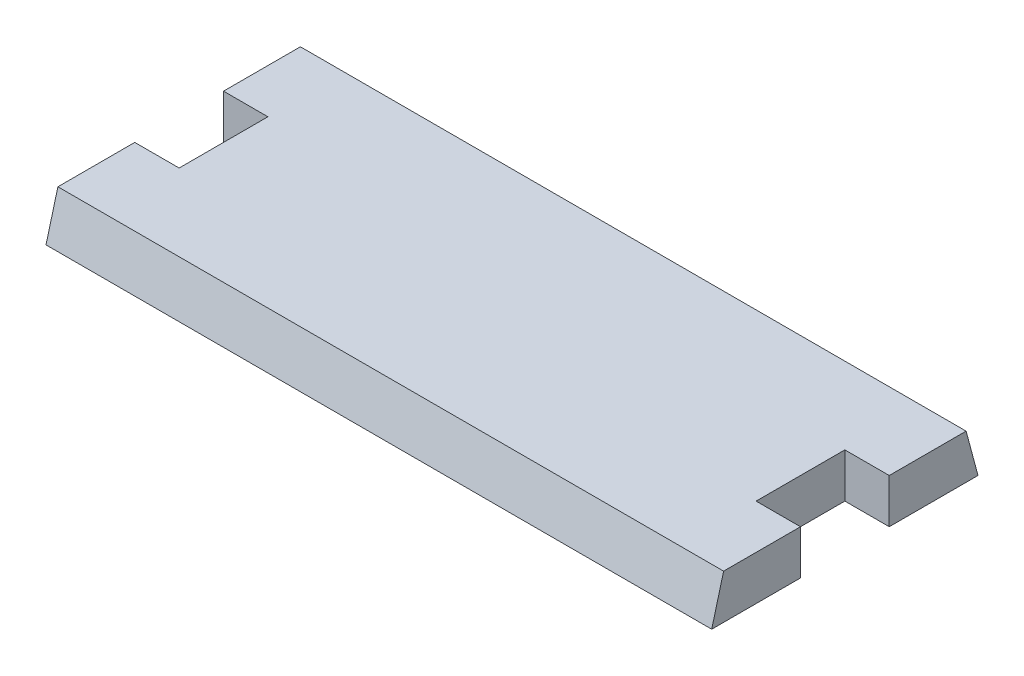
ISO-10303-21;
HEADER;
FILE_DESCRIPTION(('STEP AP214'),'2;1');
FILE_NAME('part.step','',(''),(''),'','','');
FILE_SCHEMA(('AUTOMOTIVE_DESIGN { 1 0 10303 214 1 1 1 1 }'));
ENDSEC;
DATA;
#1=APPLICATION_CONTEXT('core data for automotive mechanical design processes');
#2=APPLICATION_PROTOCOL_DEFINITION('international standard','automotive_design',2000,#1);
#3=PRODUCT_CONTEXT('',#1,'mechanical');
#4=PRODUCT('Part','Part','',(#3));
#5=PRODUCT_RELATED_PRODUCT_CATEGORY('part','',(#4));
#6=PRODUCT_DEFINITION_FORMATION('','',#4);
#7=PRODUCT_DEFINITION_CONTEXT('part definition',#1,'design');
#8=PRODUCT_DEFINITION('design','',#6,#7);
#9=PRODUCT_DEFINITION_SHAPE('','',#8);
#10=(LENGTH_UNIT() NAMED_UNIT(*) SI_UNIT(.MILLI.,.METRE.));
#11=(NAMED_UNIT(*) PLANE_ANGLE_UNIT() SI_UNIT($,.RADIAN.));
#12=(NAMED_UNIT(*) SI_UNIT($,.STERADIAN.) SOLID_ANGLE_UNIT());
#13=UNCERTAINTY_MEASURE_WITH_UNIT(LENGTH_MEASURE(1.E-05),#10,'distance_accuracy_value','');
#14=(GEOMETRIC_REPRESENTATION_CONTEXT(3) GLOBAL_UNCERTAINTY_ASSIGNED_CONTEXT((#13)) GLOBAL_UNIT_ASSIGNED_CONTEXT((#10,
#11,#12)) REPRESENTATION_CONTEXT('',''));
#15=CARTESIAN_POINT('',(0.,0.,0.));
#16=DIRECTION('',(0.,0.,1.));
#17=DIRECTION('',(1.,0.,0.));
#18=AXIS2_PLACEMENT_3D('',#15,#16,#17);
#19=CARTESIAN_POINT('',(-150.,10.,-20.));
#20=DIRECTION('',(1.,0.,0.));
#21=DIRECTION('',(0.,0.,-1.));
#22=AXIS2_PLACEMENT_3D('',#19,#20,#21);
#23=PLANE('',#22);
#24=DIRECTION('',(0.,0.,1.));
#25=VECTOR('',#24,1.);
#26=CARTESIAN_POINT('',(-150.,0.,-20.));
#27=LINE('',#26,#25);
#28=CARTESIAN_POINT('',(-150.,0.,-20.));
#29=VERTEX_POINT('',#28);
#30=CARTESIAN_POINT('',(-150.,0.,0.));
#31=VERTEX_POINT('',#30);
#32=EDGE_CURVE('E151',#29,#31,#27,.T.);
#33=ORIENTED_EDGE('',*,*,#32,.T.);
#34=DIRECTION('',(0.,0.965925826289068,-0.258819045102521));
#35=VECTOR('',#34,1.);
#36=CARTESIAN_POINT('',(-150.,0.,0.));
#37=LINE('',#36,#35);
#38=CARTESIAN_POINT('',(-150.,10.,-2.67949192431123));
#39=VERTEX_POINT('',#38);
#40=EDGE_CURVE('E11',#39,#31,#37,.F.);
#41=ORIENTED_EDGE('',*,*,#40,.F.);
#42=DIRECTION('',(0.,0.,1.));
#43=VECTOR('',#42,1.);
#44=CARTESIAN_POINT('',(-150.,10.,-20.));
#45=LINE('',#44,#43);
#46=CARTESIAN_POINT('',(-150.,10.,-20.));
#47=VERTEX_POINT('',#46);
#48=EDGE_CURVE('E175',#47,#39,#45,.T.);
#49=ORIENTED_EDGE('',*,*,#48,.F.);
#50=DIRECTION('',(0.,-1.,0.));
#51=VECTOR('',#50,1.);
#52=CARTESIAN_POINT('',(-150.,10.,-20.));
#53=LINE('',#52,#51);
#54=EDGE_CURVE('E147',#47,#29,#53,.T.);
#55=ORIENTED_EDGE('',*,*,#54,.T.);
#56=EDGE_LOOP('',(#33,#41,#49,#55));
#57=FACE_BOUND('',#56,.T.);
#58=ADVANCED_FACE('F33',(#57),#23,.F.);
#59=CARTESIAN_POINT('',(-150.,0.,0.));
#60=DIRECTION('',(0.,0.258819045102521,0.965925826289068));
#61=DIRECTION('',(0.,-0.965925826289068,0.258819045102521));
#62=AXIS2_PLACEMENT_3D('',#59,#60,#61);
#63=PLANE('',#62);
#64=DIRECTION('',(1.,0.,0.));
#65=VECTOR('',#64,1.);
#66=CARTESIAN_POINT('',(-150.,0.,0.));
#67=LINE('',#66,#65);
#68=CARTESIAN_POINT('',(0.,0.,0.));
#69=VERTEX_POINT('',#68);
#70=EDGE_CURVE('E154',#31,#69,#67,.T.);
#71=ORIENTED_EDGE('',*,*,#70,.T.);
#72=DIRECTION('',(0.,0.965925826289068,-0.258819045102521));
#73=VECTOR('',#72,1.);
#74=CARTESIAN_POINT('',(0.,9.33012701892219,-2.50000000000001));
#75=LINE('',#74,#73);
#76=CARTESIAN_POINT('',(0.,10.,-2.67949192431123));
#77=VERTEX_POINT('',#76);
#78=EDGE_CURVE('E43',#77,#69,#75,.F.);
#79=ORIENTED_EDGE('',*,*,#78,.F.);
#80=DIRECTION('',(-1.,0.,0.));
#81=VECTOR('',#80,1.);
#82=CARTESIAN_POINT('',(-150.,10.,-2.67949192431123));
#83=LINE('',#82,#81);
#84=EDGE_CURVE('E193',#39,#77,#83,.F.);
#85=ORIENTED_EDGE('',*,*,#84,.F.);
#86=ORIENTED_EDGE('',*,*,#40,.T.);
#87=EDGE_LOOP('',(#71,#79,#85,#86));
#88=FACE_BOUND('',#87,.T.);
#89=ADVANCED_FACE('F218',(#88),#63,.T.);
#90=CARTESIAN_POINT('',(0.,10.,0.));
#91=DIRECTION('',(-1.,0.,0.));
#92=DIRECTION('',(0.,0.,1.));
#93=AXIS2_PLACEMENT_3D('',#90,#91,#92);
#94=PLANE('',#93);
#95=DIRECTION('',(0.,0.,-1.));
#96=VECTOR('',#95,1.);
#97=CARTESIAN_POINT('',(0.,0.,0.));
#98=LINE('',#97,#96);
#99=CARTESIAN_POINT('',(0.,0.,-20.));
#100=VERTEX_POINT('',#99);
#101=EDGE_CURVE('E156',#69,#100,#98,.T.);
#102=ORIENTED_EDGE('',*,*,#101,.T.);
#103=DIRECTION('',(0.,-1.,0.));
#104=VECTOR('',#103,1.);
#105=CARTESIAN_POINT('',(0.,10.,-20.));
#106=LINE('',#105,#104);
#107=CARTESIAN_POINT('',(0.,10.,-20.));
#108=VERTEX_POINT('',#107);
#109=EDGE_CURVE('E190',#108,#100,#106,.T.);
#110=ORIENTED_EDGE('',*,*,#109,.F.);
#111=DIRECTION('',(0.,0.,-1.));
#112=VECTOR('',#111,1.);
#113=CARTESIAN_POINT('',(0.,10.,0.));
#114=LINE('',#113,#112);
#115=EDGE_CURVE('E195',#77,#108,#114,.T.);
#116=ORIENTED_EDGE('',*,*,#115,.F.);
#117=ORIENTED_EDGE('',*,*,#78,.T.);
#118=EDGE_LOOP('',(#102,#110,#116,#117));
#119=FACE_BOUND('',#118,.T.);
#120=ADVANCED_FACE('F223',(#119),#94,.F.);
#121=CARTESIAN_POINT('',(0.,10.,-20.));
#122=DIRECTION('',(0.,0.,1.));
#123=DIRECTION('',(1.,0.,0.));
#124=AXIS2_PLACEMENT_3D('',#121,#122,#123);
#125=PLANE('',#124);
#126=DIRECTION('',(-1.,0.,0.));
#127=VECTOR('',#126,1.);
#128=CARTESIAN_POINT('',(0.,0.,-20.));
#129=LINE('',#128,#127);
#130=CARTESIAN_POINT('',(-10.,0.,-20.));
#131=VERTEX_POINT('',#130);
#132=EDGE_CURVE('E158',#100,#131,#129,.T.);
#133=ORIENTED_EDGE('',*,*,#132,.T.);
#134=DIRECTION('',(0.,-1.,0.));
#135=VECTOR('',#134,1.);
#136=CARTESIAN_POINT('',(-10.,10.,-20.));
#137=LINE('',#136,#135);
#138=CARTESIAN_POINT('',(-10.,10.,-20.));
#139=VERTEX_POINT('',#138);
#140=EDGE_CURVE('E187',#139,#131,#137,.T.);
#141=ORIENTED_EDGE('',*,*,#140,.F.);
#142=DIRECTION('',(-1.,0.,0.));
#143=VECTOR('',#142,1.);
#144=CARTESIAN_POINT('',(0.,10.,-20.));
#145=LINE('',#144,#143);
#146=EDGE_CURVE('E207',#108,#139,#145,.T.);
#147=ORIENTED_EDGE('',*,*,#146,.F.);
#148=ORIENTED_EDGE('',*,*,#109,.T.);
#149=EDGE_LOOP('',(#133,#141,#147,#148));
#150=FACE_BOUND('',#149,.T.);
#151=ADVANCED_FACE('F230',(#150),#125,.F.);
#152=CARTESIAN_POINT('',(-10.,10.,-20.));
#153=DIRECTION('',(-1.,0.,0.));
#154=DIRECTION('',(0.,0.,1.));
#155=AXIS2_PLACEMENT_3D('',#152,#153,#154);
#156=PLANE('',#155);
#157=DIRECTION('',(0.,0.,-1.));
#158=VECTOR('',#157,1.);
#159=CARTESIAN_POINT('',(-10.,0.,-20.));
#160=LINE('',#159,#158);
#161=CARTESIAN_POINT('',(-10.,0.,-40.));
#162=VERTEX_POINT('',#161);
#163=EDGE_CURVE('E160',#131,#162,#160,.T.);
#164=ORIENTED_EDGE('',*,*,#163,.T.);
#165=DIRECTION('',(0.,-1.,0.));
#166=VECTOR('',#165,1.);
#167=CARTESIAN_POINT('',(-10.,10.,-40.));
#168=LINE('',#167,#166);
#169=CARTESIAN_POINT('',(-10.,10.,-40.));
#170=VERTEX_POINT('',#169);
#171=EDGE_CURVE('E183',#170,#162,#168,.T.);
#172=ORIENTED_EDGE('',*,*,#171,.F.);
#173=DIRECTION('',(0.,0.,-1.));
#174=VECTOR('',#173,1.);
#175=CARTESIAN_POINT('',(-10.,10.,-20.));
#176=LINE('',#175,#174);
#177=EDGE_CURVE('E203',#139,#170,#176,.T.);
#178=ORIENTED_EDGE('',*,*,#177,.F.);
#179=ORIENTED_EDGE('',*,*,#140,.T.);
#180=EDGE_LOOP('',(#164,#172,#178,#179));
#181=FACE_BOUND('',#180,.T.);
#182=ADVANCED_FACE('F234',(#181),#156,.F.);
#183=CARTESIAN_POINT('',(-10.,10.,-40.));
#184=DIRECTION('',(0.,0.,-1.));
#185=DIRECTION('',(-1.,0.,0.));
#186=AXIS2_PLACEMENT_3D('',#183,#184,#185);
#187=PLANE('',#186);
#188=DIRECTION('',(1.,0.,0.));
#189=VECTOR('',#188,1.);
#190=CARTESIAN_POINT('',(-10.,0.,-40.));
#191=LINE('',#190,#189);
#192=CARTESIAN_POINT('',(0.,0.,-40.));
#193=VERTEX_POINT('',#192);
#194=EDGE_CURVE('E162',#162,#193,#191,.T.);
#195=ORIENTED_EDGE('',*,*,#194,.T.);
#196=DIRECTION('',(0.,-1.,0.));
#197=VECTOR('',#196,1.);
#198=CARTESIAN_POINT('',(0.,10.,-40.));
#199=LINE('',#198,#197);
#200=CARTESIAN_POINT('',(0.,10.,-40.));
#201=VERTEX_POINT('',#200);
#202=EDGE_CURVE('E180',#201,#193,#199,.T.);
#203=ORIENTED_EDGE('',*,*,#202,.F.);
#204=DIRECTION('',(1.,0.,0.));
#205=VECTOR('',#204,1.);
#206=CARTESIAN_POINT('',(-10.,10.,-40.));
#207=LINE('',#206,#205);
#208=EDGE_CURVE('E113',#170,#201,#207,.T.);
#209=ORIENTED_EDGE('',*,*,#208,.F.);
#210=ORIENTED_EDGE('',*,*,#171,.T.);
#211=EDGE_LOOP('',(#195,#203,#209,#210));
#212=FACE_BOUND('',#211,.T.);
#213=ADVANCED_FACE('F237',(#212),#187,.F.);
#214=CARTESIAN_POINT('',(0.,10.,-40.));
#215=DIRECTION('',(-1.,0.,0.));
#216=DIRECTION('',(0.,0.,1.));
#217=AXIS2_PLACEMENT_3D('',#214,#215,#216);
#218=PLANE('',#217);
#219=DIRECTION('',(0.,0.,-1.));
#220=VECTOR('',#219,1.);
#221=CARTESIAN_POINT('',(0.,0.,-40.));
#222=LINE('',#221,#220);
#223=CARTESIAN_POINT('',(0.,0.,-60.));
#224=VERTEX_POINT('',#223);
#225=EDGE_CURVE('E164',#193,#224,#222,.T.);
#226=ORIENTED_EDGE('',*,*,#225,.T.);
#227=DIRECTION('',(0.,0.965925826289068,0.258819045102521));
#228=VECTOR('',#227,1.);
#229=CARTESIAN_POINT('',(0.,0.,-60.));
#230=LINE('',#229,#228);
#231=CARTESIAN_POINT('',(0.,10.,-57.3205080756888));
#232=VERTEX_POINT('',#231);
#233=EDGE_CURVE('E184',#232,#224,#230,.F.);
#234=ORIENTED_EDGE('',*,*,#233,.F.);
#235=DIRECTION('',(0.,0.,-1.));
#236=VECTOR('',#235,1.);
#237=CARTESIAN_POINT('',(0.,10.,-40.));
#238=LINE('',#237,#236);
#239=EDGE_CURVE('E106',#201,#232,#238,.T.);
#240=ORIENTED_EDGE('',*,*,#239,.F.);
#241=ORIENTED_EDGE('',*,*,#202,.T.);
#242=EDGE_LOOP('',(#226,#234,#240,#241));
#243=FACE_BOUND('',#242,.T.);
#244=ADVANCED_FACE('F240',(#243),#218,.F.);
#245=CARTESIAN_POINT('',(0.,0.,-60.));
#246=DIRECTION('',(0.,0.258819045102521,-0.965925826289068));
#247=DIRECTION('',(0.,0.965925826289068,0.258819045102521));
#248=AXIS2_PLACEMENT_3D('',#245,#246,#247);
#249=PLANE('',#248);
#250=DIRECTION('',(-1.,0.,0.));
#251=VECTOR('',#250,1.);
#252=CARTESIAN_POINT('',(0.,0.,-60.));
#253=LINE('',#252,#251);
#254=CARTESIAN_POINT('',(-150.,0.,-60.));
#255=VERTEX_POINT('',#254);
#256=EDGE_CURVE('E166',#224,#255,#253,.T.);
#257=ORIENTED_EDGE('',*,*,#256,.T.);
#258=DIRECTION('',(0.,0.965925826289068,0.258819045102521));
#259=VECTOR('',#258,1.);
#260=CARTESIAN_POINT('',(-150.,9.33012701892219,-57.5));
#261=LINE('',#260,#259);
#262=CARTESIAN_POINT('',(-150.,10.,-57.3205080756887));
#263=VERTEX_POINT('',#262);
#264=EDGE_CURVE('E37',#263,#255,#261,.F.);
#265=ORIENTED_EDGE('',*,*,#264,.F.);
#266=DIRECTION('',(1.,0.,0.));
#267=VECTOR('',#266,1.);
#268=CARTESIAN_POINT('',(0.,10.,-57.3205080756888));
#269=LINE('',#268,#267);
#270=EDGE_CURVE('E199',#232,#263,#269,.F.);
#271=ORIENTED_EDGE('',*,*,#270,.F.);
#272=ORIENTED_EDGE('',*,*,#233,.T.);
#273=EDGE_LOOP('',(#257,#265,#271,#272));
#274=FACE_BOUND('',#273,.T.);
#275=ADVANCED_FACE('F35',(#274),#249,.T.);
#276=CARTESIAN_POINT('',(-150.,10.,-60.));
#277=DIRECTION('',(1.,0.,0.));
#278=DIRECTION('',(0.,0.,-1.));
#279=AXIS2_PLACEMENT_3D('',#276,#277,#278);
#280=PLANE('',#279);
#281=DIRECTION('',(0.,0.,1.));
#282=VECTOR('',#281,1.);
#283=CARTESIAN_POINT('',(-150.,0.,-60.));
#284=LINE('',#283,#282);
#285=CARTESIAN_POINT('',(-150.,0.,-40.));
#286=VERTEX_POINT('',#285);
#287=EDGE_CURVE('E168',#255,#286,#284,.T.);
#288=ORIENTED_EDGE('',*,*,#287,.T.);
#289=DIRECTION('',(0.,-1.,0.));
#290=VECTOR('',#289,1.);
#291=CARTESIAN_POINT('',(-150.,10.,-40.));
#292=LINE('',#291,#290);
#293=CARTESIAN_POINT('',(-150.,10.,-40.));
#294=VERTEX_POINT('',#293);
#295=EDGE_CURVE('E141',#294,#286,#292,.T.);
#296=ORIENTED_EDGE('',*,*,#295,.F.);
#297=DIRECTION('',(0.,0.,1.));
#298=VECTOR('',#297,1.);
#299=CARTESIAN_POINT('',(-150.,10.,-60.));
#300=LINE('',#299,#298);
#301=EDGE_CURVE('E129',#263,#294,#300,.T.);
#302=ORIENTED_EDGE('',*,*,#301,.F.);
#303=ORIENTED_EDGE('',*,*,#264,.T.);
#304=EDGE_LOOP('',(#288,#296,#302,#303));
#305=FACE_BOUND('',#304,.T.);
#306=ADVANCED_FACE('F246',(#305),#280,.F.);
#307=CARTESIAN_POINT('',(-150.,10.,-40.));
#308=DIRECTION('',(0.,0.,-1.));
#309=DIRECTION('',(-1.,0.,0.));
#310=AXIS2_PLACEMENT_3D('',#307,#308,#309);
#311=PLANE('',#310);
#312=DIRECTION('',(1.,0.,0.));
#313=VECTOR('',#312,1.);
#314=CARTESIAN_POINT('',(-150.,0.,-40.));
#315=LINE('',#314,#313);
#316=CARTESIAN_POINT('',(-140.,0.,-40.));
#317=VERTEX_POINT('',#316);
#318=EDGE_CURVE('E138',#286,#317,#315,.T.);
#319=ORIENTED_EDGE('',*,*,#318,.T.);
#320=DIRECTION('',(0.,-1.,0.));
#321=VECTOR('',#320,1.);
#322=CARTESIAN_POINT('',(-140.,10.,-40.));
#323=LINE('',#322,#321);
#324=CARTESIAN_POINT('',(-140.,10.,-40.));
#325=VERTEX_POINT('',#324);
#326=EDGE_CURVE('E135',#325,#317,#323,.T.);
#327=ORIENTED_EDGE('',*,*,#326,.F.);
#328=DIRECTION('',(1.,0.,0.));
#329=VECTOR('',#328,1.);
#330=CARTESIAN_POINT('',(-150.,10.,-40.));
#331=LINE('',#330,#329);
#332=EDGE_CURVE('E122',#294,#325,#331,.T.);
#333=ORIENTED_EDGE('',*,*,#332,.F.);
#334=ORIENTED_EDGE('',*,*,#295,.T.);
#335=EDGE_LOOP('',(#319,#327,#333,#334));
#336=FACE_BOUND('',#335,.T.);
#337=ADVANCED_FACE('F136',(#336),#311,.F.);
#338=CARTESIAN_POINT('',(-140.,10.,-40.));
#339=DIRECTION('',(1.,0.,0.));
#340=DIRECTION('',(0.,0.,-1.));
#341=AXIS2_PLACEMENT_3D('',#338,#339,#340);
#342=PLANE('',#341);
#343=DIRECTION('',(0.,0.,1.));
#344=VECTOR('',#343,1.);
#345=CARTESIAN_POINT('',(-140.,0.,-40.));
#346=LINE('',#345,#344);
#347=CARTESIAN_POINT('',(-140.,0.,-20.));
#348=VERTEX_POINT('',#347);
#349=EDGE_CURVE('E171',#317,#348,#346,.T.);
#350=ORIENTED_EDGE('',*,*,#349,.T.);
#351=DIRECTION('',(0.,-1.,0.));
#352=VECTOR('',#351,1.);
#353=CARTESIAN_POINT('',(-140.,10.,-20.));
#354=LINE('',#353,#352);
#355=CARTESIAN_POINT('',(-140.,10.,-20.));
#356=VERTEX_POINT('',#355);
#357=EDGE_CURVE('E142',#356,#348,#354,.T.);
#358=ORIENTED_EDGE('',*,*,#357,.F.);
#359=DIRECTION('',(0.,0.,1.));
#360=VECTOR('',#359,1.);
#361=CARTESIAN_POINT('',(-140.,10.,-40.));
#362=LINE('',#361,#360);
#363=EDGE_CURVE('E126',#325,#356,#362,.T.);
#364=ORIENTED_EDGE('',*,*,#363,.F.);
#365=ORIENTED_EDGE('',*,*,#326,.T.);
#366=EDGE_LOOP('',(#350,#358,#364,#365));
#367=FACE_BOUND('',#366,.T.);
#368=ADVANCED_FACE('F144',(#367),#342,.F.);
#369=CARTESIAN_POINT('',(-140.,10.,-20.));
#370=DIRECTION('',(0.,0.,1.));
#371=DIRECTION('',(1.,0.,0.));
#372=AXIS2_PLACEMENT_3D('',#369,#370,#371);
#373=PLANE('',#372);
#374=DIRECTION('',(-1.,0.,0.));
#375=VECTOR('',#374,1.);
#376=CARTESIAN_POINT('',(-140.,0.,-20.));
#377=LINE('',#376,#375);
#378=EDGE_CURVE('E173',#348,#29,#377,.T.);
#379=ORIENTED_EDGE('',*,*,#378,.T.);
#380=ORIENTED_EDGE('',*,*,#54,.F.);
#381=DIRECTION('',(-1.,0.,0.));
#382=VECTOR('',#381,1.);
#383=CARTESIAN_POINT('',(-140.,10.,-20.));
#384=LINE('',#383,#382);
#385=EDGE_CURVE('E52',#356,#47,#384,.T.);
#386=ORIENTED_EDGE('',*,*,#385,.F.);
#387=ORIENTED_EDGE('',*,*,#357,.T.);
#388=EDGE_LOOP('',(#379,#380,#386,#387));
#389=FACE_BOUND('',#388,.T.);
#390=ADVANCED_FACE('F251',(#389),#373,.F.);
#391=CARTESIAN_POINT('',(0.,10.,0.));
#392=DIRECTION('',(0.,1.,0.));
#393=DIRECTION('',(0.,0.,1.));
#394=AXIS2_PLACEMENT_3D('',#391,#392,#393);
#395=PLANE('',#394);
#396=ORIENTED_EDGE('',*,*,#48,.T.);
#397=ORIENTED_EDGE('',*,*,#84,.T.);
#398=ORIENTED_EDGE('',*,*,#115,.T.);
#399=ORIENTED_EDGE('',*,*,#146,.T.);
#400=ORIENTED_EDGE('',*,*,#177,.T.);
#401=ORIENTED_EDGE('',*,*,#208,.T.);
#402=ORIENTED_EDGE('',*,*,#239,.T.);
#403=ORIENTED_EDGE('',*,*,#270,.T.);
#404=ORIENTED_EDGE('',*,*,#301,.T.);
#405=ORIENTED_EDGE('',*,*,#332,.T.);
#406=ORIENTED_EDGE('',*,*,#363,.T.);
#407=ORIENTED_EDGE('',*,*,#385,.T.);
#408=EDGE_LOOP('',(#396,#397,#398,#399,#400,#401,#402,#403,#404,#405,#406,#407));
#409=FACE_BOUND('',#408,.T.);
#410=ADVANCED_FACE('F124',(#409),#395,.T.);
#411=CARTESIAN_POINT('',(0.,0.,0.));
#412=DIRECTION('',(0.,1.,0.));
#413=DIRECTION('',(0.,0.,1.));
#414=AXIS2_PLACEMENT_3D('',#411,#412,#413);
#415=PLANE('',#414);
#416=ORIENTED_EDGE('',*,*,#32,.F.);
#417=ORIENTED_EDGE('',*,*,#378,.F.);
#418=ORIENTED_EDGE('',*,*,#349,.F.);
#419=ORIENTED_EDGE('',*,*,#318,.F.);
#420=ORIENTED_EDGE('',*,*,#287,.F.);
#421=ORIENTED_EDGE('',*,*,#256,.F.);
#422=ORIENTED_EDGE('',*,*,#225,.F.);
#423=ORIENTED_EDGE('',*,*,#194,.F.);
#424=ORIENTED_EDGE('',*,*,#163,.F.);
#425=ORIENTED_EDGE('',*,*,#132,.F.);
#426=ORIENTED_EDGE('',*,*,#101,.F.);
#427=ORIENTED_EDGE('',*,*,#70,.F.);
#428=EDGE_LOOP('',(#416,#417,#418,#419,#420,#421,#422,#423,#424,#425,#426,#427));
#429=FACE_BOUND('',#428,.T.);
#430=ADVANCED_FACE('F248',(#429),#415,.F.);
#431=CLOSED_SHELL('',(#58,#89,#120,#151,#182,#213,#244,#275,#306,#337,#368,#390,#410,#430));
#432=MANIFOLD_SOLID_BREP('B2',#431);
#433=ADVANCED_BREP_SHAPE_REPRESENTATION('',(#18,#432),#14);
#434=SHAPE_DEFINITION_REPRESENTATION(#9,#433);
ENDSEC;
END-ISO-10303-21;
